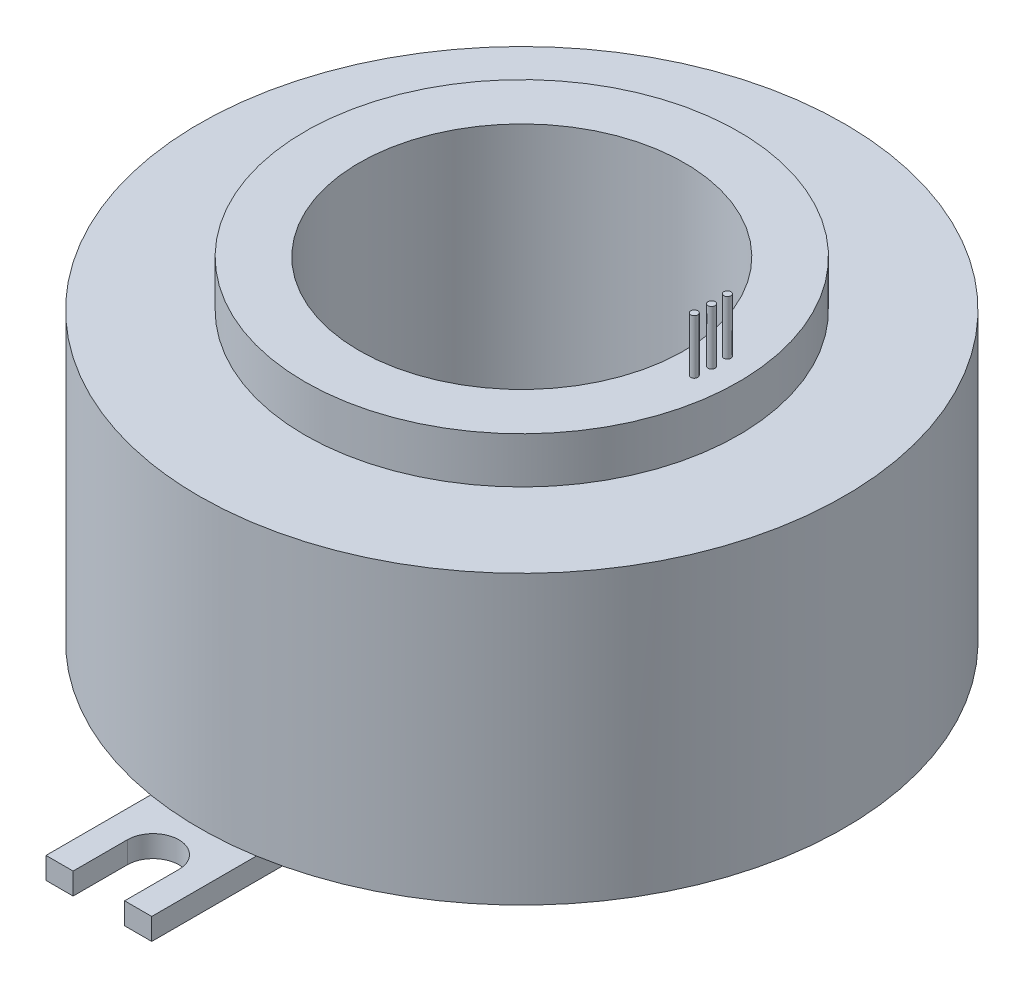
ISO-10303-21;
HEADER;
FILE_DESCRIPTION(('STEP AP214'),'2;1');
FILE_NAME('part.step','',(''),(''),'','','');
FILE_SCHEMA(('AUTOMOTIVE_DESIGN { 1 0 10303 214 1 1 1 1 }'));
ENDSEC;
DATA;
#1=APPLICATION_CONTEXT('core data for automotive mechanical design processes');
#2=APPLICATION_PROTOCOL_DEFINITION('international standard','automotive_design',2000,#1);
#3=PRODUCT_CONTEXT('',#1,'mechanical');
#4=PRODUCT('Part','Part','',(#3));
#5=PRODUCT_RELATED_PRODUCT_CATEGORY('part','',(#4));
#6=PRODUCT_DEFINITION_FORMATION('','',#4);
#7=PRODUCT_DEFINITION_CONTEXT('part definition',#1,'design');
#8=PRODUCT_DEFINITION('design','',#6,#7);
#9=PRODUCT_DEFINITION_SHAPE('','',#8);
#10=(LENGTH_UNIT() NAMED_UNIT(*) SI_UNIT(.MILLI.,.METRE.));
#11=(NAMED_UNIT(*) PLANE_ANGLE_UNIT() SI_UNIT($,.RADIAN.));
#12=(NAMED_UNIT(*) SI_UNIT($,.STERADIAN.) SOLID_ANGLE_UNIT());
#13=UNCERTAINTY_MEASURE_WITH_UNIT(LENGTH_MEASURE(1.E-05),#10,'distance_accuracy_value','');
#14=(GEOMETRIC_REPRESENTATION_CONTEXT(3) GLOBAL_UNCERTAINTY_ASSIGNED_CONTEXT((#13)) GLOBAL_UNIT_ASSIGNED_CONTEXT((#10,
#11,#12)) REPRESENTATION_CONTEXT('',''));
#15=CARTESIAN_POINT('',(0.,0.,0.));
#16=DIRECTION('',(0.,0.,1.));
#17=DIRECTION('',(1.,0.,0.));
#18=AXIS2_PLACEMENT_3D('',#15,#16,#17);
#19=CARTESIAN_POINT('',(0.,0.,0.));
#20=DIRECTION('',(0.,1.,0.));
#21=DIRECTION('',(0.,0.,1.));
#22=AXIS2_PLACEMENT_3D('',#19,#20,#21);
#23=PLANE('',#22);
#24=CARTESIAN_POINT('',(0.,0.,0.));
#25=DIRECTION('',(0.,1.,0.));
#26=DIRECTION('',(0.,0.,1.));
#27=AXIS2_PLACEMENT_3D('',#24,#25,#26);
#28=CIRCLE('',#27,30.);
#29=CARTESIAN_POINT('',(0.,0.,30.));
#30=VERTEX_POINT('',#29);
#31=EDGE_CURVE('E242',#30,#30,#28,.F.);
#32=ORIENTED_EDGE('',*,*,#31,.F.);
#33=EDGE_LOOP('',(#32));
#34=FACE_BOUND('',#33,.T.);
#35=CARTESIAN_POINT('',(45.,0.,0.));
#36=DIRECTION('',(0.,1.,0.));
#37=DIRECTION('',(0.,0.,1.));
#38=AXIS2_PLACEMENT_3D('',#35,#36,#37);
#39=CIRCLE('',#38,0.649999999999997);
#40=CARTESIAN_POINT('',(45.,0.,0.649999999999997));
#41=VERTEX_POINT('',#40);
#42=EDGE_CURVE('E255',#41,#41,#39,.F.);
#43=ORIENTED_EDGE('',*,*,#42,.F.);
#44=EDGE_LOOP('',(#43));
#45=FACE_BOUND('',#44,.T.);
#46=CARTESIAN_POINT('',(44.8287614141286,0.,3.92200842364462));
#47=DIRECTION('',(0.,1.,0.));
#48=DIRECTION('',(0.,0.,1.));
#49=AXIS2_PLACEMENT_3D('',#46,#47,#48);
#50=CIRCLE('',#49,0.649999999999997);
#51=CARTESIAN_POINT('',(44.8287614141286,0.,4.57200842364462));
#52=VERTEX_POINT('',#51);
#53=EDGE_CURVE('E267',#52,#52,#50,.F.);
#54=ORIENTED_EDGE('',*,*,#53,.F.);
#55=EDGE_LOOP('',(#54));
#56=FACE_BOUND('',#55,.T.);
#57=CARTESIAN_POINT('',(44.8287614141285,0.,-3.92200842364462));
#58=DIRECTION('',(0.,1.,0.));
#59=DIRECTION('',(0.,0.,1.));
#60=AXIS2_PLACEMENT_3D('',#57,#58,#59);
#61=CIRCLE('',#60,0.649999999999997);
#62=CARTESIAN_POINT('',(44.8287614141285,0.,-3.27200842364463));
#63=VERTEX_POINT('',#62);
#64=EDGE_CURVE('E52',#63,#63,#61,.F.);
#65=ORIENTED_EDGE('',*,*,#64,.F.);
#66=EDGE_LOOP('',(#65));
#67=FACE_BOUND('',#66,.T.);
#68=DIRECTION('',(0.,0.,-1.));
#69=VECTOR('',#68,1.);
#70=CARTESIAN_POINT('',(-9.74999999999999,0.,0.));
#71=LINE('',#70,#69);
#72=CARTESIAN_POINT('',(-9.75,0.,58.6957196054363));
#73=VERTEX_POINT('',#72);
#74=CARTESIAN_POINT('',(-9.75,0.,48.));
#75=VERTEX_POINT('',#74);
#76=EDGE_CURVE('E11',#73,#75,#71,.T.);
#77=ORIENTED_EDGE('',*,*,#76,.F.);
#78=CARTESIAN_POINT('',(0.,0.,0.));
#79=DIRECTION('',(0.,1.,0.));
#80=DIRECTION('',(0.,0.,1.));
#81=AXIS2_PLACEMENT_3D('',#78,#79,#80);
#82=CIRCLE('',#81,59.5);
#83=CARTESIAN_POINT('',(9.75,0.,58.6957196054363));
#84=VERTEX_POINT('',#83);
#85=EDGE_CURVE('E260',#84,#73,#82,.T.);
#86=ORIENTED_EDGE('',*,*,#85,.F.);
#87=DIRECTION('',(0.,0.,1.));
#88=VECTOR('',#87,1.);
#89=CARTESIAN_POINT('',(9.75000000000002,0.,0.));
#90=LINE('',#89,#88);
#91=CARTESIAN_POINT('',(9.75000000000001,0.,48.));
#92=VERTEX_POINT('',#91);
#93=EDGE_CURVE('E63',#92,#84,#90,.T.);
#94=ORIENTED_EDGE('',*,*,#93,.F.);
#95=DIRECTION('',(1.,0.,0.));
#96=VECTOR('',#95,1.);
#97=CARTESIAN_POINT('',(0.,0.,48.));
#98=LINE('',#97,#96);
#99=EDGE_CURVE('E59',#75,#92,#98,.T.);
#100=ORIENTED_EDGE('',*,*,#99,.F.);
#101=EDGE_LOOP('',(#77,#86,#94,#100));
#102=FACE_BOUND('',#101,.T.);
#103=ADVANCED_FACE('F43',(#34,#45,#56,#67,#102),#23,.F.);
#104=CARTESIAN_POINT('',(0.,53.,0.));
#105=DIRECTION('',(0.,-1.,0.));
#106=DIRECTION('',(0.,0.,-1.));
#107=AXIS2_PLACEMENT_3D('',#104,#105,#106);
#108=CYLINDRICAL_SURFACE('',#107,59.5);
#109=CARTESIAN_POINT('',(0.,53.,0.));
#110=DIRECTION('',(0.,1.,0.));
#111=DIRECTION('',(0.,0.,1.));
#112=AXIS2_PLACEMENT_3D('',#109,#110,#111);
#113=CIRCLE('',#112,59.5);
#114=CARTESIAN_POINT('',(0.,53.,59.5));
#115=VERTEX_POINT('',#114);
#116=EDGE_CURVE('E256',#115,#115,#113,.T.);
#117=ORIENTED_EDGE('',*,*,#116,.F.);
#118=EDGE_LOOP('',(#117));
#119=FACE_BOUND('',#118,.T.);
#120=ORIENTED_EDGE('',*,*,#85,.T.);
#121=EDGE_CURVE('E250',#73,#84,#82,.T.);
#122=ORIENTED_EDGE('',*,*,#121,.T.);
#123=EDGE_LOOP('',(#120,#122));
#124=FACE_BOUND('',#123,.T.);
#125=ADVANCED_FACE('F45',(#119,#124),#108,.T.);
#126=CARTESIAN_POINT('',(0.,53.,0.));
#127=DIRECTION('',(0.,1.,0.));
#128=DIRECTION('',(0.,0.,1.));
#129=AXIS2_PLACEMENT_3D('',#126,#127,#128);
#130=PLANE('',#129);
#131=CARTESIAN_POINT('',(0.,53.,0.));
#132=DIRECTION('',(0.,1.,0.));
#133=DIRECTION('',(0.,0.,1.));
#134=AXIS2_PLACEMENT_3D('',#131,#132,#133);
#135=CIRCLE('',#134,40.);
#136=CARTESIAN_POINT('',(0.,53.,40.));
#137=VERTEX_POINT('',#136);
#138=EDGE_CURVE('E251',#137,#137,#135,.T.);
#139=ORIENTED_EDGE('',*,*,#138,.F.);
#140=EDGE_LOOP('',(#139));
#141=FACE_BOUND('',#140,.T.);
#142=ORIENTED_EDGE('',*,*,#116,.T.);
#143=EDGE_LOOP('',(#142));
#144=FACE_BOUND('',#143,.T.);
#145=ADVANCED_FACE('F384',(#141,#144),#130,.T.);
#146=CARTESIAN_POINT('',(0.,61.5,0.));
#147=DIRECTION('',(0.,-1.,0.));
#148=DIRECTION('',(0.,0.,-1.));
#149=AXIS2_PLACEMENT_3D('',#146,#147,#148);
#150=CYLINDRICAL_SURFACE('',#149,40.);
#151=CARTESIAN_POINT('',(0.,61.5,0.));
#152=DIRECTION('',(0.,1.,0.));
#153=DIRECTION('',(0.,0.,1.));
#154=AXIS2_PLACEMENT_3D('',#151,#152,#153);
#155=CIRCLE('',#154,40.);
#156=CARTESIAN_POINT('',(0.,61.5,40.));
#157=VERTEX_POINT('',#156);
#158=EDGE_CURVE('E246',#157,#157,#155,.T.);
#159=ORIENTED_EDGE('',*,*,#158,.F.);
#160=EDGE_LOOP('',(#159));
#161=FACE_BOUND('',#160,.T.);
#162=ORIENTED_EDGE('',*,*,#138,.T.);
#163=EDGE_LOOP('',(#162));
#164=FACE_BOUND('',#163,.T.);
#165=ADVANCED_FACE('F380',(#161,#164),#150,.T.);
#166=CARTESIAN_POINT('',(0.,61.5,0.));
#167=DIRECTION('',(0.,1.,0.));
#168=DIRECTION('',(0.,0.,1.));
#169=AXIS2_PLACEMENT_3D('',#166,#167,#168);
#170=PLANE('',#169);
#171=CARTESIAN_POINT('',(34.8668144332111,61.5,3.05045099616804));
#172=DIRECTION('',(0.,1.,0.));
#173=DIRECTION('',(0.,0.,-1.));
#174=AXIS2_PLACEMENT_3D('',#171,#172,#173);
#175=CIRCLE('',#174,0.649999999999997);
#176=CARTESIAN_POINT('',(34.8668144332111,61.5,2.40045099616804));
#177=VERTEX_POINT('',#176);
#178=EDGE_CURVE('E214',#177,#177,#175,.T.);
#179=ORIENTED_EDGE('',*,*,#178,.F.);
#180=EDGE_LOOP('',(#179));
#181=FACE_BOUND('',#180,.T.);
#182=CARTESIAN_POINT('',(34.8668144332111,61.5,-3.05045099616804));
#183=DIRECTION('',(0.,1.,0.));
#184=DIRECTION('',(0.,0.,1.));
#185=AXIS2_PLACEMENT_3D('',#182,#183,#184);
#186=CIRCLE('',#185,0.649999999999997);
#187=CARTESIAN_POINT('',(34.8668144332111,61.5,-2.40045099616804));
#188=VERTEX_POINT('',#187);
#189=EDGE_CURVE('E219',#188,#188,#186,.T.);
#190=ORIENTED_EDGE('',*,*,#189,.F.);
#191=EDGE_LOOP('',(#190));
#192=FACE_BOUND('',#191,.T.);
#193=CARTESIAN_POINT('',(35.,61.5,0.));
#194=DIRECTION('',(0.,1.,0.));
#195=DIRECTION('',(0.,0.,1.));
#196=AXIS2_PLACEMENT_3D('',#193,#194,#195);
#197=CIRCLE('',#196,0.649999999999997);
#198=CARTESIAN_POINT('',(35.,61.5,0.649999999999997));
#199=VERTEX_POINT('',#198);
#200=EDGE_CURVE('E227',#199,#199,#197,.T.);
#201=ORIENTED_EDGE('',*,*,#200,.F.);
#202=EDGE_LOOP('',(#201));
#203=FACE_BOUND('',#202,.T.);
#204=CARTESIAN_POINT('',(0.,61.5,0.));
#205=DIRECTION('',(0.,1.,0.));
#206=DIRECTION('',(0.,0.,1.));
#207=AXIS2_PLACEMENT_3D('',#204,#205,#206);
#208=CIRCLE('',#207,30.);
#209=CARTESIAN_POINT('',(0.,61.5,30.));
#210=VERTEX_POINT('',#209);
#211=EDGE_CURVE('E235',#210,#210,#208,.T.);
#212=ORIENTED_EDGE('',*,*,#211,.F.);
#213=EDGE_LOOP('',(#212));
#214=FACE_BOUND('',#213,.T.);
#215=ORIENTED_EDGE('',*,*,#158,.T.);
#216=EDGE_LOOP('',(#215));
#217=FACE_BOUND('',#216,.T.);
#218=ADVANCED_FACE('F376',(#181,#192,#203,#214,#217),#170,.T.);
#219=CARTESIAN_POINT('',(0.,-0.001000000000001,0.));
#220=DIRECTION('',(0.,1.,0.));
#221=DIRECTION('',(0.,0.,1.));
#222=AXIS2_PLACEMENT_3D('',#219,#220,#221);
#223=CYLINDRICAL_SURFACE('',#222,30.);
#224=ORIENTED_EDGE('',*,*,#211,.T.);
#225=EDGE_LOOP('',(#224));
#226=FACE_BOUND('',#225,.T.);
#227=ORIENTED_EDGE('',*,*,#31,.T.);
#228=EDGE_LOOP('',(#227));
#229=FACE_BOUND('',#228,.T.);
#230=ADVANCED_FACE('F372',(#226,#229),#223,.F.);
#231=CARTESIAN_POINT('',(35.,71.5,0.));
#232=DIRECTION('',(0.,-1.,0.));
#233=DIRECTION('',(0.,0.,-1.));
#234=AXIS2_PLACEMENT_3D('',#231,#232,#233);
#235=CYLINDRICAL_SURFACE('',#234,0.649999999999997);
#236=CARTESIAN_POINT('',(35.,71.5,0.));
#237=DIRECTION('',(0.,1.,0.));
#238=DIRECTION('',(0.,0.,1.));
#239=AXIS2_PLACEMENT_3D('',#236,#237,#238);
#240=CIRCLE('',#239,0.649999999999997);
#241=CARTESIAN_POINT('',(35.,71.5,0.649999999999997));
#242=VERTEX_POINT('',#241);
#243=EDGE_CURVE('E231',#242,#242,#240,.T.);
#244=ORIENTED_EDGE('',*,*,#243,.F.);
#245=EDGE_LOOP('',(#244));
#246=FACE_BOUND('',#245,.T.);
#247=ORIENTED_EDGE('',*,*,#200,.T.);
#248=EDGE_LOOP('',(#247));
#249=FACE_BOUND('',#248,.T.);
#250=ADVANCED_FACE('F368',(#246,#249),#235,.T.);
#251=CARTESIAN_POINT('',(35.,71.5,0.));
#252=DIRECTION('',(0.,1.,0.));
#253=DIRECTION('',(0.,0.,1.));
#254=AXIS2_PLACEMENT_3D('',#251,#252,#253);
#255=PLANE('',#254);
#256=ORIENTED_EDGE('',*,*,#243,.T.);
#257=EDGE_LOOP('',(#256));
#258=FACE_BOUND('',#257,.T.);
#259=ADVANCED_FACE('F364',(#258),#255,.T.);
#260=CARTESIAN_POINT('',(34.8668144332111,71.5,-3.05045099616804));
#261=DIRECTION('',(0.,-1.,0.));
#262=DIRECTION('',(0.,0.,-1.));
#263=AXIS2_PLACEMENT_3D('',#260,#261,#262);
#264=CYLINDRICAL_SURFACE('',#263,0.649999999999997);
#265=CARTESIAN_POINT('',(34.8668144332111,71.5,-3.05045099616804));
#266=DIRECTION('',(0.,1.,0.));
#267=DIRECTION('',(0.,0.,1.));
#268=AXIS2_PLACEMENT_3D('',#265,#266,#267);
#269=CIRCLE('',#268,0.649999999999997);
#270=CARTESIAN_POINT('',(34.8668144332111,71.5,-2.40045099616804));
#271=VERTEX_POINT('',#270);
#272=EDGE_CURVE('E223',#271,#271,#269,.T.);
#273=ORIENTED_EDGE('',*,*,#272,.F.);
#274=EDGE_LOOP('',(#273));
#275=FACE_BOUND('',#274,.T.);
#276=ORIENTED_EDGE('',*,*,#189,.T.);
#277=EDGE_LOOP('',(#276));
#278=FACE_BOUND('',#277,.T.);
#279=ADVANCED_FACE('F360',(#275,#278),#264,.T.);
#280=CARTESIAN_POINT('',(34.8668144332111,71.5,-3.05045099616804));
#281=DIRECTION('',(0.,1.,0.));
#282=DIRECTION('',(0.,0.,1.));
#283=AXIS2_PLACEMENT_3D('',#280,#281,#282);
#284=PLANE('',#283);
#285=ORIENTED_EDGE('',*,*,#272,.T.);
#286=EDGE_LOOP('',(#285));
#287=FACE_BOUND('',#286,.T.);
#288=ADVANCED_FACE('F356',(#287),#284,.T.);
#289=CARTESIAN_POINT('',(34.8668144332111,71.5,3.05045099616804));
#290=DIRECTION('',(0.,-1.,0.));
#291=DIRECTION('',(0.,0.,-1.));
#292=AXIS2_PLACEMENT_3D('',#289,#290,#291);
#293=CYLINDRICAL_SURFACE('',#292,0.649999999999997);
#294=CARTESIAN_POINT('',(34.8668144332111,71.5,3.05045099616804));
#295=DIRECTION('',(0.,1.,0.));
#296=DIRECTION('',(0.,0.,-1.));
#297=AXIS2_PLACEMENT_3D('',#294,#295,#296);
#298=CIRCLE('',#297,0.649999999999997);
#299=CARTESIAN_POINT('',(34.8668144332111,71.5,2.40045099616804));
#300=VERTEX_POINT('',#299);
#301=EDGE_CURVE('E215',#300,#300,#298,.T.);
#302=ORIENTED_EDGE('',*,*,#301,.F.);
#303=EDGE_LOOP('',(#302));
#304=FACE_BOUND('',#303,.T.);
#305=ORIENTED_EDGE('',*,*,#178,.T.);
#306=EDGE_LOOP('',(#305));
#307=FACE_BOUND('',#306,.T.);
#308=ADVANCED_FACE('F352',(#304,#307),#293,.T.);
#309=CARTESIAN_POINT('',(34.8668144332111,71.5,3.05045099616804));
#310=DIRECTION('',(0.,-1.,0.));
#311=DIRECTION('',(0.,0.,-1.));
#312=AXIS2_PLACEMENT_3D('',#309,#310,#311);
#313=PLANE('',#312);
#314=ORIENTED_EDGE('',*,*,#301,.T.);
#315=EDGE_LOOP('',(#314));
#316=FACE_BOUND('',#315,.T.);
#317=ADVANCED_FACE('F348',(#316),#313,.F.);
#318=CARTESIAN_POINT('',(45.,-10.,0.));
#319=DIRECTION('',(0.,1.,0.));
#320=DIRECTION('',(0.,0.,1.));
#321=AXIS2_PLACEMENT_3D('',#318,#319,#320);
#322=CYLINDRICAL_SURFACE('',#321,0.649999999999997);
#323=CARTESIAN_POINT('',(45.,-10.,0.));
#324=DIRECTION('',(0.,-1.,0.));
#325=DIRECTION('',(0.,0.,-1.));
#326=AXIS2_PLACEMENT_3D('',#323,#324,#325);
#327=CIRCLE('',#326,0.649999999999997);
#328=CARTESIAN_POINT('',(45.,-10.,-0.649999999999997));
#329=VERTEX_POINT('',#328);
#330=EDGE_CURVE('E210',#329,#329,#327,.T.);
#331=ORIENTED_EDGE('',*,*,#330,.F.);
#332=EDGE_LOOP('',(#331));
#333=FACE_BOUND('',#332,.T.);
#334=ORIENTED_EDGE('',*,*,#42,.T.);
#335=EDGE_LOOP('',(#334));
#336=FACE_BOUND('',#335,.T.);
#337=ADVANCED_FACE('F344',(#333,#336),#322,.T.);
#338=CARTESIAN_POINT('',(45.,-10.,0.));
#339=DIRECTION('',(0.,-1.,0.));
#340=DIRECTION('',(0.,0.,-1.));
#341=AXIS2_PLACEMENT_3D('',#338,#339,#340);
#342=PLANE('',#341);
#343=ORIENTED_EDGE('',*,*,#330,.T.);
#344=EDGE_LOOP('',(#343));
#345=FACE_BOUND('',#344,.T.);
#346=ADVANCED_FACE('F340',(#345),#342,.T.);
#347=CARTESIAN_POINT('',(44.8287614141286,-10.,3.92200842364462));
#348=DIRECTION('',(0.,1.,0.));
#349=DIRECTION('',(0.,0.,1.));
#350=AXIS2_PLACEMENT_3D('',#347,#348,#349);
#351=CYLINDRICAL_SURFACE('',#350,0.649999999999997);
#352=CARTESIAN_POINT('',(44.8287614141286,-10.,3.92200842364462));
#353=DIRECTION('',(0.,-1.,0.));
#354=DIRECTION('',(0.,0.,-1.));
#355=AXIS2_PLACEMENT_3D('',#352,#353,#354);
#356=CIRCLE('',#355,0.649999999999997);
#357=CARTESIAN_POINT('',(44.8287614141286,-10.,3.27200842364463));
#358=VERTEX_POINT('',#357);
#359=EDGE_CURVE('E206',#358,#358,#356,.T.);
#360=ORIENTED_EDGE('',*,*,#359,.F.);
#361=EDGE_LOOP('',(#360));
#362=FACE_BOUND('',#361,.T.);
#363=ORIENTED_EDGE('',*,*,#53,.T.);
#364=EDGE_LOOP('',(#363));
#365=FACE_BOUND('',#364,.T.);
#366=ADVANCED_FACE('F336',(#362,#365),#351,.T.);
#367=CARTESIAN_POINT('',(44.8287614141286,-10.,3.92200842364462));
#368=DIRECTION('',(0.,-1.,0.));
#369=DIRECTION('',(0.,0.,-1.));
#370=AXIS2_PLACEMENT_3D('',#367,#368,#369);
#371=PLANE('',#370);
#372=ORIENTED_EDGE('',*,*,#359,.T.);
#373=EDGE_LOOP('',(#372));
#374=FACE_BOUND('',#373,.T.);
#375=ADVANCED_FACE('F332',(#374),#371,.T.);
#376=CARTESIAN_POINT('',(44.8287614141285,-10.,-3.92200842364462));
#377=DIRECTION('',(0.,1.,0.));
#378=DIRECTION('',(0.,0.,1.));
#379=AXIS2_PLACEMENT_3D('',#376,#377,#378);
#380=CYLINDRICAL_SURFACE('',#379,0.649999999999997);
#381=CARTESIAN_POINT('',(44.8287614141285,-10.,-3.92200842364462));
#382=DIRECTION('',(0.,-1.,0.));
#383=DIRECTION('',(0.,0.,1.));
#384=AXIS2_PLACEMENT_3D('',#381,#382,#383);
#385=CIRCLE('',#384,0.649999999999997);
#386=CARTESIAN_POINT('',(44.8287614141285,-10.,-3.27200842364463));
#387=VERTEX_POINT('',#386);
#388=EDGE_CURVE('E124',#387,#387,#385,.T.);
#389=ORIENTED_EDGE('',*,*,#388,.F.);
#390=EDGE_LOOP('',(#389));
#391=FACE_BOUND('',#390,.T.);
#392=ORIENTED_EDGE('',*,*,#64,.T.);
#393=EDGE_LOOP('',(#392));
#394=FACE_BOUND('',#393,.T.);
#395=ADVANCED_FACE('F274',(#391,#394),#380,.T.);
#396=CARTESIAN_POINT('',(44.8287614141285,-10.,-3.92200842364462));
#397=DIRECTION('',(0.,1.,0.));
#398=DIRECTION('',(0.,0.,1.));
#399=AXIS2_PLACEMENT_3D('',#396,#397,#398);
#400=PLANE('',#399);
#401=ORIENTED_EDGE('',*,*,#388,.T.);
#402=EDGE_LOOP('',(#401));
#403=FACE_BOUND('',#402,.T.);
#404=ADVANCED_FACE('F326',(#403),#400,.F.);
#405=CARTESIAN_POINT('',(0.,-4.,68.));
#406=DIRECTION('',(0.,1.,0.));
#407=DIRECTION('',(0.,0.,1.));
#408=AXIS2_PLACEMENT_3D('',#405,#406,#407);
#409=CYLINDRICAL_SURFACE('',#408,4.75);
#410=CARTESIAN_POINT('',(0.,0.,68.));
#411=DIRECTION('',(0.,-1.,0.));
#412=DIRECTION('',(0.,0.,-1.));
#413=AXIS2_PLACEMENT_3D('',#410,#411,#412);
#414=CIRCLE('',#413,4.75);
#415=CARTESIAN_POINT('',(-4.75,0.,68.));
#416=VERTEX_POINT('',#415);
#417=CARTESIAN_POINT('',(4.75,0.,68.));
#418=VERTEX_POINT('',#417);
#419=EDGE_CURVE('E119',#416,#418,#414,.T.);
#420=ORIENTED_EDGE('',*,*,#419,.F.);
#421=DIRECTION('',(0.,1.,0.));
#422=VECTOR('',#421,1.);
#423=CARTESIAN_POINT('',(-4.75,-4.,68.));
#424=LINE('',#423,#422);
#425=CARTESIAN_POINT('',(-4.75,-4.,68.));
#426=VERTEX_POINT('',#425);
#427=EDGE_CURVE('E112',#426,#416,#424,.T.);
#428=ORIENTED_EDGE('',*,*,#427,.F.);
#429=CARTESIAN_POINT('',(0.,-4.,68.));
#430=DIRECTION('',(0.,-1.,0.));
#431=DIRECTION('',(0.,0.,-1.));
#432=AXIS2_PLACEMENT_3D('',#429,#430,#431);
#433=CIRCLE('',#432,4.75);
#434=CARTESIAN_POINT('',(4.75,-4.,68.));
#435=VERTEX_POINT('',#434);
#436=EDGE_CURVE('E116',#426,#435,#433,.T.);
#437=ORIENTED_EDGE('',*,*,#436,.T.);
#438=DIRECTION('',(0.,1.,0.));
#439=VECTOR('',#438,1.);
#440=CARTESIAN_POINT('',(4.75,-4.,68.));
#441=LINE('',#440,#439);
#442=EDGE_CURVE('E162',#435,#418,#441,.T.);
#443=ORIENTED_EDGE('',*,*,#442,.T.);
#444=EDGE_LOOP('',(#420,#428,#437,#443));
#445=FACE_BOUND('',#444,.T.);
#446=ADVANCED_FACE('F114',(#445),#409,.F.);
#447=CARTESIAN_POINT('',(-4.75,-4.,0.));
#448=DIRECTION('',(-1.,0.,0.));
#449=DIRECTION('',(0.,0.,1.));
#450=AXIS2_PLACEMENT_3D('',#447,#448,#449);
#451=PLANE('',#450);
#452=DIRECTION('',(0.,0.,1.));
#453=VECTOR('',#452,1.);
#454=CARTESIAN_POINT('',(-4.75,0.,0.));
#455=LINE('',#454,#453);
#456=CARTESIAN_POINT('',(-4.75,0.,78.));
#457=VERTEX_POINT('',#456);
#458=EDGE_CURVE('E165',#416,#457,#455,.T.);
#459=ORIENTED_EDGE('',*,*,#458,.T.);
#460=DIRECTION('',(0.,1.,0.));
#461=VECTOR('',#460,1.);
#462=CARTESIAN_POINT('',(-4.75,-4.,78.));
#463=LINE('',#462,#461);
#464=CARTESIAN_POINT('',(-4.75,-4.,78.));
#465=VERTEX_POINT('',#464);
#466=EDGE_CURVE('E125',#465,#457,#463,.T.);
#467=ORIENTED_EDGE('',*,*,#466,.F.);
#468=DIRECTION('',(0.,0.,1.));
#469=VECTOR('',#468,1.);
#470=CARTESIAN_POINT('',(-4.75,-4.,0.));
#471=LINE('',#470,#469);
#472=EDGE_CURVE('E128',#426,#465,#471,.T.);
#473=ORIENTED_EDGE('',*,*,#472,.F.);
#474=ORIENTED_EDGE('',*,*,#427,.T.);
#475=EDGE_LOOP('',(#459,#467,#473,#474));
#476=FACE_BOUND('',#475,.T.);
#477=ADVANCED_FACE('F129',(#476),#451,.F.);
#478=CARTESIAN_POINT('',(0.,-4.,78.));
#479=DIRECTION('',(0.,0.,1.));
#480=DIRECTION('',(1.,0.,0.));
#481=AXIS2_PLACEMENT_3D('',#478,#479,#480);
#482=PLANE('',#481);
#483=DIRECTION('',(1.,0.,0.));
#484=VECTOR('',#483,1.);
#485=CARTESIAN_POINT('',(0.,0.,78.));
#486=LINE('',#485,#484);
#487=CARTESIAN_POINT('',(-9.75,0.,78.));
#488=VERTEX_POINT('',#487);
#489=EDGE_CURVE('E168',#488,#457,#486,.T.);
#490=ORIENTED_EDGE('',*,*,#489,.F.);
#491=DIRECTION('',(0.,1.,0.));
#492=VECTOR('',#491,1.);
#493=CARTESIAN_POINT('',(-9.75,-4.,78.));
#494=LINE('',#493,#492);
#495=CARTESIAN_POINT('',(-9.75,-4.,78.));
#496=VERTEX_POINT('',#495);
#497=EDGE_CURVE('E198',#496,#488,#494,.T.);
#498=ORIENTED_EDGE('',*,*,#497,.F.);
#499=DIRECTION('',(1.,0.,0.));
#500=VECTOR('',#499,1.);
#501=CARTESIAN_POINT('',(0.,-4.,78.));
#502=LINE('',#501,#500);
#503=EDGE_CURVE('E134',#496,#465,#502,.T.);
#504=ORIENTED_EDGE('',*,*,#503,.T.);
#505=ORIENTED_EDGE('',*,*,#466,.T.);
#506=EDGE_LOOP('',(#490,#498,#504,#505));
#507=FACE_BOUND('',#506,.T.);
#508=ADVANCED_FACE('F293',(#507),#482,.T.);
#509=CARTESIAN_POINT('',(-9.74999999999999,-4.,0.));
#510=DIRECTION('',(1.,0.,0.));
#511=DIRECTION('',(0.,0.,-1.));
#512=AXIS2_PLACEMENT_3D('',#509,#510,#511);
#513=PLANE('',#512);
#514=DIRECTION('',(0.,0.,-1.));
#515=VECTOR('',#514,1.);
#516=CARTESIAN_POINT('',(-9.74999999999999,0.,0.));
#517=LINE('',#516,#515);
#518=EDGE_CURVE('E172',#488,#73,#517,.T.);
#519=ORIENTED_EDGE('',*,*,#518,.T.);
#520=ORIENTED_EDGE('',*,*,#76,.T.);
#521=DIRECTION('',(0.,1.,0.));
#522=VECTOR('',#521,1.);
#523=CARTESIAN_POINT('',(-9.75,-4.,48.));
#524=LINE('',#523,#522);
#525=CARTESIAN_POINT('',(-9.75,-4.,48.));
#526=VERTEX_POINT('',#525);
#527=EDGE_CURVE('E194',#526,#75,#524,.T.);
#528=ORIENTED_EDGE('',*,*,#527,.F.);
#529=DIRECTION('',(0.,0.,-1.));
#530=VECTOR('',#529,1.);
#531=CARTESIAN_POINT('',(-9.74999999999999,-4.,0.));
#532=LINE('',#531,#530);
#533=EDGE_CURVE('E150',#496,#526,#532,.T.);
#534=ORIENTED_EDGE('',*,*,#533,.F.);
#535=ORIENTED_EDGE('',*,*,#497,.T.);
#536=EDGE_LOOP('',(#519,#520,#528,#534,#535));
#537=FACE_BOUND('',#536,.T.);
#538=ADVANCED_FACE('F290',(#537),#513,.F.);
#539=CARTESIAN_POINT('',(0.,-4.,48.));
#540=DIRECTION('',(0.,0.,1.));
#541=DIRECTION('',(1.,0.,0.));
#542=AXIS2_PLACEMENT_3D('',#539,#540,#541);
#543=PLANE('',#542);
#544=ORIENTED_EDGE('',*,*,#99,.T.);
#545=DIRECTION('',(0.,1.,0.));
#546=VECTOR('',#545,1.);
#547=CARTESIAN_POINT('',(9.75000000000001,-4.,48.));
#548=LINE('',#547,#546);
#549=CARTESIAN_POINT('',(9.75000000000001,-4.,48.));
#550=VERTEX_POINT('',#549);
#551=EDGE_CURVE('E190',#550,#92,#548,.T.);
#552=ORIENTED_EDGE('',*,*,#551,.F.);
#553=DIRECTION('',(1.,0.,0.));
#554=VECTOR('',#553,1.);
#555=CARTESIAN_POINT('',(0.,-4.,48.));
#556=LINE('',#555,#554);
#557=EDGE_CURVE('E154',#526,#550,#556,.T.);
#558=ORIENTED_EDGE('',*,*,#557,.F.);
#559=ORIENTED_EDGE('',*,*,#527,.T.);
#560=EDGE_LOOP('',(#544,#552,#558,#559));
#561=FACE_BOUND('',#560,.T.);
#562=ADVANCED_FACE('F310',(#561),#543,.F.);
#563=CARTESIAN_POINT('',(9.75000000000002,-4.,0.));
#564=DIRECTION('',(-1.,0.,0.));
#565=DIRECTION('',(0.,0.,1.));
#566=AXIS2_PLACEMENT_3D('',#563,#564,#565);
#567=PLANE('',#566);
#568=ORIENTED_EDGE('',*,*,#93,.T.);
#569=CARTESIAN_POINT('',(9.75,0.,78.));
#570=VERTEX_POINT('',#569);
#571=EDGE_CURVE('E178',#84,#570,#90,.T.);
#572=ORIENTED_EDGE('',*,*,#571,.T.);
#573=DIRECTION('',(0.,1.,0.));
#574=VECTOR('',#573,1.);
#575=CARTESIAN_POINT('',(9.75,-4.,78.));
#576=LINE('',#575,#574);
#577=CARTESIAN_POINT('',(9.75,-4.,78.));
#578=VERTEX_POINT('',#577);
#579=EDGE_CURVE('E186',#578,#570,#576,.T.);
#580=ORIENTED_EDGE('',*,*,#579,.F.);
#581=DIRECTION('',(0.,0.,1.));
#582=VECTOR('',#581,1.);
#583=CARTESIAN_POINT('',(9.75000000000002,-4.,0.));
#584=LINE('',#583,#582);
#585=EDGE_CURVE('E157',#550,#578,#584,.T.);
#586=ORIENTED_EDGE('',*,*,#585,.F.);
#587=ORIENTED_EDGE('',*,*,#551,.T.);
#588=EDGE_LOOP('',(#568,#572,#580,#586,#587));
#589=FACE_BOUND('',#588,.T.);
#590=ADVANCED_FACE('F305',(#589),#567,.F.);
#591=CARTESIAN_POINT('',(4.75,0.,78.));
#592=VERTEX_POINT('',#591);
#593=EDGE_CURVE('E145',#592,#570,#486,.T.);
#594=ORIENTED_EDGE('',*,*,#593,.F.);
#595=DIRECTION('',(0.,1.,0.));
#596=VECTOR('',#595,1.);
#597=CARTESIAN_POINT('',(4.75,-4.,78.));
#598=LINE('',#597,#596);
#599=CARTESIAN_POINT('',(4.75,-4.,78.));
#600=VERTEX_POINT('',#599);
#601=EDGE_CURVE('E183',#600,#592,#598,.T.);
#602=ORIENTED_EDGE('',*,*,#601,.F.);
#603=EDGE_CURVE('E151',#600,#578,#502,.T.);
#604=ORIENTED_EDGE('',*,*,#603,.T.);
#605=ORIENTED_EDGE('',*,*,#579,.T.);
#606=EDGE_LOOP('',(#594,#602,#604,#605));
#607=FACE_BOUND('',#606,.T.);
#608=ADVANCED_FACE('F300',(#607),#482,.T.);
#609=CARTESIAN_POINT('',(4.75,-4.,0.));
#610=DIRECTION('',(-1.,0.,0.));
#611=DIRECTION('',(0.,0.,1.));
#612=AXIS2_PLACEMENT_3D('',#609,#610,#611);
#613=PLANE('',#612);
#614=DIRECTION('',(0.,0.,1.));
#615=VECTOR('',#614,1.);
#616=CARTESIAN_POINT('',(4.75,0.,0.));
#617=LINE('',#616,#615);
#618=EDGE_CURVE('E141',#418,#592,#617,.T.);
#619=ORIENTED_EDGE('',*,*,#618,.F.);
#620=ORIENTED_EDGE('',*,*,#442,.F.);
#621=DIRECTION('',(0.,0.,1.));
#622=VECTOR('',#621,1.);
#623=CARTESIAN_POINT('',(4.75,-4.,0.));
#624=LINE('',#623,#622);
#625=EDGE_CURVE('E139',#435,#600,#624,.T.);
#626=ORIENTED_EDGE('',*,*,#625,.T.);
#627=ORIENTED_EDGE('',*,*,#601,.T.);
#628=EDGE_LOOP('',(#619,#620,#626,#627));
#629=FACE_BOUND('',#628,.T.);
#630=ADVANCED_FACE('F296',(#629),#613,.T.);
#631=CARTESIAN_POINT('',(0.,-4.,0.));
#632=DIRECTION('',(0.,-1.,0.));
#633=DIRECTION('',(0.,0.,-1.));
#634=AXIS2_PLACEMENT_3D('',#631,#632,#633);
#635=PLANE('',#634);
#636=ORIENTED_EDGE('',*,*,#436,.F.);
#637=ORIENTED_EDGE('',*,*,#472,.T.);
#638=ORIENTED_EDGE('',*,*,#503,.F.);
#639=ORIENTED_EDGE('',*,*,#533,.T.);
#640=ORIENTED_EDGE('',*,*,#557,.T.);
#641=ORIENTED_EDGE('',*,*,#585,.T.);
#642=ORIENTED_EDGE('',*,*,#603,.F.);
#643=ORIENTED_EDGE('',*,*,#625,.F.);
#644=EDGE_LOOP('',(#636,#637,#638,#639,#640,#641,#642,#643));
#645=FACE_BOUND('',#644,.T.);
#646=ADVANCED_FACE('F136',(#645),#635,.T.);
#647=CARTESIAN_POINT('',(0.,0.,0.));
#648=DIRECTION('',(0.,-1.,0.));
#649=DIRECTION('',(0.,0.,-1.));
#650=AXIS2_PLACEMENT_3D('',#647,#648,#649);
#651=PLANE('',#650);
#652=ORIENTED_EDGE('',*,*,#571,.F.);
#653=ORIENTED_EDGE('',*,*,#121,.F.);
#654=ORIENTED_EDGE('',*,*,#518,.F.);
#655=ORIENTED_EDGE('',*,*,#489,.T.);
#656=ORIENTED_EDGE('',*,*,#458,.F.);
#657=ORIENTED_EDGE('',*,*,#419,.T.);
#658=ORIENTED_EDGE('',*,*,#618,.T.);
#659=ORIENTED_EDGE('',*,*,#593,.T.);
#660=EDGE_LOOP('',(#652,#653,#654,#655,#656,#657,#658,#659));
#661=FACE_BOUND('',#660,.T.);
#662=ADVANCED_FACE('F286',(#661),#651,.F.);
#663=CLOSED_SHELL('',(#103,#125,#145,#165,#218,#230,#250,#259,#279,#288,#308,#317,#337,#346,
#366,#375,#395,#404,#446,#477,#508,#538,#562,#590,#608,#630,#646,#662));
#664=MANIFOLD_SOLID_BREP('B2',#663);
#665=ADVANCED_BREP_SHAPE_REPRESENTATION('',(#18,#664),#14);
#666=SHAPE_DEFINITION_REPRESENTATION(#9,#665);
ENDSEC;
END-ISO-10303-21;
